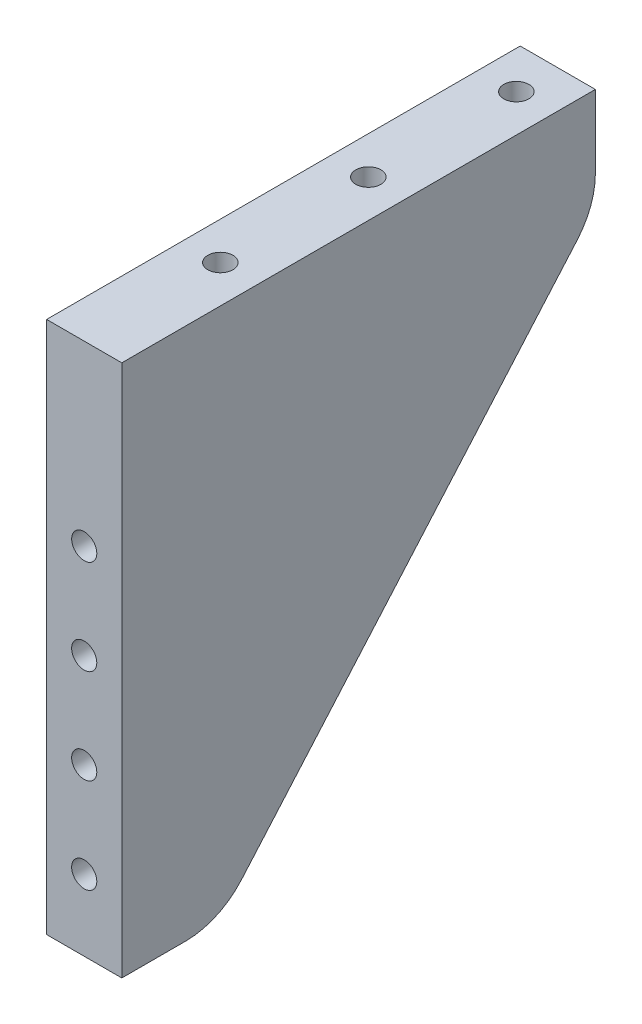
ISO-10303-21;
HEADER;
FILE_DESCRIPTION(('STEP AP214'),'2;1');
FILE_NAME('part.step','',(''),(''),'','','');
FILE_SCHEMA(('AUTOMOTIVE_DESIGN { 1 0 10303 214 1 1 1 1 }'));
ENDSEC;
DATA;
#1=APPLICATION_CONTEXT('core data for automotive mechanical design processes');
#2=APPLICATION_PROTOCOL_DEFINITION('international standard','automotive_design',2000,#1);
#3=PRODUCT_CONTEXT('',#1,'mechanical');
#4=PRODUCT('Part','Part','',(#3));
#5=PRODUCT_RELATED_PRODUCT_CATEGORY('part','',(#4));
#6=PRODUCT_DEFINITION_FORMATION('','',#4);
#7=PRODUCT_DEFINITION_CONTEXT('part definition',#1,'design');
#8=PRODUCT_DEFINITION('design','',#6,#7);
#9=PRODUCT_DEFINITION_SHAPE('','',#8);
#10=(LENGTH_UNIT() NAMED_UNIT(*) SI_UNIT(.MILLI.,.METRE.));
#11=(NAMED_UNIT(*) PLANE_ANGLE_UNIT() SI_UNIT($,.RADIAN.));
#12=(NAMED_UNIT(*) SI_UNIT($,.STERADIAN.) SOLID_ANGLE_UNIT());
#13=UNCERTAINTY_MEASURE_WITH_UNIT(LENGTH_MEASURE(1.E-05),#10,'distance_accuracy_value','');
#14=(GEOMETRIC_REPRESENTATION_CONTEXT(3) GLOBAL_UNCERTAINTY_ASSIGNED_CONTEXT((#13)) GLOBAL_UNIT_ASSIGNED_CONTEXT((#10,
#11,#12)) REPRESENTATION_CONTEXT('',''));
#15=CARTESIAN_POINT('',(0.,0.,0.));
#16=DIRECTION('',(0.,0.,1.));
#17=DIRECTION('',(1.,0.,0.));
#18=AXIS2_PLACEMENT_3D('',#15,#16,#17);
#19=CARTESIAN_POINT('',(12.7,0.,0.));
#20=DIRECTION('',(0.,1.,0.));
#21=DIRECTION('',(0.,0.,1.));
#22=AXIS2_PLACEMENT_3D('',#19,#20,#21);
#23=PLANE('',#22);
#24=DIRECTION('',(0.,0.,-1.));
#25=VECTOR('',#24,1.);
#26=CARTESIAN_POINT('',(12.7,0.,0.));
#27=LINE('',#26,#25);
#28=CARTESIAN_POINT('',(12.7,0.,-5.09999999999999));
#29=VERTEX_POINT('',#28);
#30=CARTESIAN_POINT('',(12.7,0.,-26.7092377084169));
#31=VERTEX_POINT('',#30);
#32=EDGE_CURVE('E89',#29,#31,#27,.T.);
#33=ORIENTED_EDGE('',*,*,#32,.F.);
#34=DIRECTION('',(1.,0.,0.));
#35=VECTOR('',#34,1.);
#36=CARTESIAN_POINT('',(-19.05,0.,-5.09999999999999));
#37=LINE('',#36,#35);
#38=CARTESIAN_POINT('',(-12.7,0.,-5.09999999999999));
#39=VERTEX_POINT('',#38);
#40=EDGE_CURVE('E182',#39,#29,#37,.T.);
#41=ORIENTED_EDGE('',*,*,#40,.F.);
#42=DIRECTION('',(0.,0.,-1.));
#43=VECTOR('',#42,1.);
#44=CARTESIAN_POINT('',(-12.7,0.,0.));
#45=LINE('',#44,#43);
#46=CARTESIAN_POINT('',(-12.7,0.,-26.7092377084169));
#47=VERTEX_POINT('',#46);
#48=EDGE_CURVE('E184',#39,#47,#45,.T.);
#49=ORIENTED_EDGE('',*,*,#48,.T.);
#50=DIRECTION('',(-1.,0.,0.));
#51=VECTOR('',#50,1.);
#52=CARTESIAN_POINT('',(12.7,0.,-26.7092377084169));
#53=LINE('',#52,#51);
#54=EDGE_CURVE('E211',#31,#47,#53,.T.);
#55=ORIENTED_EDGE('',*,*,#54,.F.);
#56=EDGE_LOOP('',(#33,#41,#49,#55));
#57=FACE_BOUND('',#56,.T.);
#58=ADVANCED_FACE('F38',(#57),#23,.F.);
#59=CARTESIAN_POINT('',(12.7,25.,-26.709237708417));
#60=DIRECTION('',(-1.,0.,0.));
#61=DIRECTION('',(0.,0.,1.));
#62=AXIS2_PLACEMENT_3D('',#59,#60,#61);
#63=CYLINDRICAL_SURFACE('',#62,25.);
#64=CARTESIAN_POINT('',(-12.7,25.,-26.709237708417));
#65=DIRECTION('',(1.,0.,0.));
#66=DIRECTION('',(0.,0.,-1.));
#67=AXIS2_PLACEMENT_3D('',#64,#65,#66);
#68=CIRCLE('',#67,25.);
#69=CARTESIAN_POINT('',(-12.7,8.59553212688041,-45.5743757625047));
#70=VERTEX_POINT('',#69);
#71=EDGE_CURVE('E198',#47,#70,#68,.T.);
#72=ORIENTED_EDGE('',*,*,#71,.T.);
#73=DIRECTION('',(-1.,0.,0.));
#74=VECTOR('',#73,1.);
#75=CARTESIAN_POINT('',(12.7,8.59553212688041,-45.5743757625047));
#76=LINE('',#75,#74);
#77=CARTESIAN_POINT('',(12.7,8.59553212688041,-45.5743757625047));
#78=VERTEX_POINT('',#77);
#79=EDGE_CURVE('E208',#78,#70,#76,.T.);
#80=ORIENTED_EDGE('',*,*,#79,.F.);
#81=CARTESIAN_POINT('',(12.7,25.,-26.709237708417));
#82=DIRECTION('',(1.,0.,0.));
#83=DIRECTION('',(0.,0.,-1.));
#84=AXIS2_PLACEMENT_3D('',#81,#82,#83);
#85=CIRCLE('',#84,25.);
#86=EDGE_CURVE('E188',#31,#78,#85,.T.);
#87=ORIENTED_EDGE('',*,*,#86,.F.);
#88=ORIENTED_EDGE('',*,*,#54,.T.);
#89=EDGE_LOOP('',(#72,#80,#87,#88));
#90=FACE_BOUND('',#89,.T.);
#91=ADVANCED_FACE('F231',(#90),#63,.T.);
#92=CARTESIAN_POINT('',(12.7,8.59553212688041,-45.5743757625047));
#93=DIRECTION('',(0.,0.656178714924787,0.754605522163505));
#94=DIRECTION('',(0.,-0.754605522163505,0.656178714924787));
#95=AXIS2_PLACEMENT_3D('',#92,#93,#94);
#96=PLANE('',#95);
#97=DIRECTION('',(0.,0.754605522163505,-0.656178714924787));
#98=VECTOR('',#97,1.);
#99=CARTESIAN_POINT('',(-12.7,8.59553212688041,-45.5743757625047));
#100=LINE('',#99,#98);
#101=CARTESIAN_POINT('',(-12.7,138.994908762201,-158.965138054088));
#102=VERTEX_POINT('',#101);
#103=EDGE_CURVE('E200',#70,#102,#100,.T.);
#104=ORIENTED_EDGE('',*,*,#103,.T.);
#105=DIRECTION('',(-1.,0.,0.));
#106=VECTOR('',#105,1.);
#107=CARTESIAN_POINT('',(12.7,138.994908762201,-158.965138054088));
#108=LINE('',#107,#106);
#109=CARTESIAN_POINT('',(12.7,138.994908762201,-158.965138054088));
#110=VERTEX_POINT('',#109);
#111=EDGE_CURVE('E206',#110,#102,#108,.T.);
#112=ORIENTED_EDGE('',*,*,#111,.F.);
#113=DIRECTION('',(0.,0.754605522163505,-0.656178714924787));
#114=VECTOR('',#113,1.);
#115=CARTESIAN_POINT('',(12.7,8.59553212688041,-45.5743757625047));
#116=LINE('',#115,#114);
#117=EDGE_CURVE('E191',#78,#110,#116,.T.);
#118=ORIENTED_EDGE('',*,*,#117,.F.);
#119=ORIENTED_EDGE('',*,*,#79,.T.);
#120=EDGE_LOOP('',(#104,#112,#118,#119));
#121=FACE_BOUND('',#120,.T.);
#122=ADVANCED_FACE('F227',(#121),#96,.F.);
#123=CARTESIAN_POINT('',(12.7,155.39937663532,-140.1));
#124=DIRECTION('',(-1.,0.,0.));
#125=DIRECTION('',(0.,0.,1.));
#126=AXIS2_PLACEMENT_3D('',#123,#124,#125);
#127=CYLINDRICAL_SURFACE('',#126,25.);
#128=CARTESIAN_POINT('',(-12.7,155.39937663532,-140.1));
#129=DIRECTION('',(1.,0.,0.));
#130=DIRECTION('',(0.,0.,-1.));
#131=AXIS2_PLACEMENT_3D('',#128,#129,#130);
#132=CIRCLE('',#131,25.);
#133=CARTESIAN_POINT('',(-12.7,155.399376635321,-165.1));
#134=VERTEX_POINT('',#133);
#135=EDGE_CURVE('E82',#102,#134,#132,.T.);
#136=ORIENTED_EDGE('',*,*,#135,.T.);
#137=DIRECTION('',(-1.,0.,0.));
#138=VECTOR('',#137,1.);
#139=CARTESIAN_POINT('',(12.7,155.399376635321,-165.1));
#140=LINE('',#139,#138);
#141=CARTESIAN_POINT('',(12.7,155.399376635321,-165.1));
#142=VERTEX_POINT('',#141);
#143=EDGE_CURVE('E196',#142,#134,#140,.T.);
#144=ORIENTED_EDGE('',*,*,#143,.F.);
#145=CARTESIAN_POINT('',(12.7,155.39937663532,-140.1));
#146=DIRECTION('',(1.,0.,0.));
#147=DIRECTION('',(0.,0.,-1.));
#148=AXIS2_PLACEMENT_3D('',#145,#146,#147);
#149=CIRCLE('',#148,25.);
#150=EDGE_CURVE('E61',#110,#142,#149,.T.);
#151=ORIENTED_EDGE('',*,*,#150,.F.);
#152=ORIENTED_EDGE('',*,*,#111,.T.);
#153=EDGE_LOOP('',(#136,#144,#151,#152));
#154=FACE_BOUND('',#153,.T.);
#155=ADVANCED_FACE('F221',(#154),#127,.T.);
#156=CARTESIAN_POINT('',(12.7,155.399376635321,-165.1));
#157=DIRECTION('',(0.,0.,1.));
#158=DIRECTION('',(1.,0.,0.));
#159=AXIS2_PLACEMENT_3D('',#156,#157,#158);
#160=PLANE('',#159);
#161=DIRECTION('',(0.,1.,0.));
#162=VECTOR('',#161,1.);
#163=CARTESIAN_POINT('',(-12.7,155.399376635321,-165.1));
#164=LINE('',#163,#162);
#165=CARTESIAN_POINT('',(-12.7,180.,-165.1));
#166=VERTEX_POINT('',#165);
#167=EDGE_CURVE('E189',#134,#166,#164,.T.);
#168=ORIENTED_EDGE('',*,*,#167,.T.);
#169=DIRECTION('',(1.,0.,0.));
#170=VECTOR('',#169,1.);
#171=CARTESIAN_POINT('',(-19.05,180.,-165.1));
#172=LINE('',#171,#170);
#173=CARTESIAN_POINT('',(12.7,180.,-165.1));
#174=VERTEX_POINT('',#173);
#175=EDGE_CURVE('E52',#166,#174,#172,.T.);
#176=ORIENTED_EDGE('',*,*,#175,.T.);
#177=DIRECTION('',(0.,1.,0.));
#178=VECTOR('',#177,1.);
#179=CARTESIAN_POINT('',(12.7,155.399376635321,-165.1));
#180=LINE('',#179,#178);
#181=EDGE_CURVE('E194',#142,#174,#180,.T.);
#182=ORIENTED_EDGE('',*,*,#181,.F.);
#183=ORIENTED_EDGE('',*,*,#143,.T.);
#184=EDGE_LOOP('',(#168,#176,#182,#183));
#185=FACE_BOUND('',#184,.T.);
#186=ADVANCED_FACE('F219',(#185),#160,.F.);
#187=CARTESIAN_POINT('',(12.7,25.,-26.709237708417));
#188=DIRECTION('',(1.,0.,0.));
#189=DIRECTION('',(0.,0.,-1.));
#190=AXIS2_PLACEMENT_3D('',#187,#188,#189);
#191=PLANE('',#190);
#192=DIRECTION('',(0.,1.,0.));
#193=VECTOR('',#192,1.);
#194=CARTESIAN_POINT('',(12.7,0.,-5.09999999999999));
#195=LINE('',#194,#193);
#196=CARTESIAN_POINT('',(12.7,180.,-5.09999999999999));
#197=VERTEX_POINT('',#196);
#198=EDGE_CURVE('E176',#29,#197,#195,.T.);
#199=ORIENTED_EDGE('',*,*,#198,.F.);
#200=ORIENTED_EDGE('',*,*,#32,.T.);
#201=ORIENTED_EDGE('',*,*,#86,.T.);
#202=ORIENTED_EDGE('',*,*,#117,.T.);
#203=ORIENTED_EDGE('',*,*,#150,.T.);
#204=ORIENTED_EDGE('',*,*,#181,.T.);
#205=DIRECTION('',(0.,0.,-1.));
#206=VECTOR('',#205,1.);
#207=CARTESIAN_POINT('',(12.7,180.,-5.09999999999999));
#208=LINE('',#207,#206);
#209=EDGE_CURVE('E179',#197,#174,#208,.T.);
#210=ORIENTED_EDGE('',*,*,#209,.F.);
#211=EDGE_LOOP('',(#199,#200,#201,#202,#203,#204,#210));
#212=FACE_BOUND('',#211,.T.);
#213=ADVANCED_FACE('F237',(#212),#191,.T.);
#214=CARTESIAN_POINT('',(-12.7,25.,-26.709237708417));
#215=DIRECTION('',(1.,0.,0.));
#216=DIRECTION('',(0.,0.,-1.));
#217=AXIS2_PLACEMENT_3D('',#214,#215,#216);
#218=PLANE('',#217);
#219=ORIENTED_EDGE('',*,*,#48,.F.);
#220=DIRECTION('',(0.,1.,0.));
#221=VECTOR('',#220,1.);
#222=CARTESIAN_POINT('',(-12.7,25.,-5.09999999999999));
#223=LINE('',#222,#221);
#224=CARTESIAN_POINT('',(-12.7,180.,-5.09999999999999));
#225=VERTEX_POINT('',#224);
#226=EDGE_CURVE('E11',#39,#225,#223,.T.);
#227=ORIENTED_EDGE('',*,*,#226,.T.);
#228=DIRECTION('',(0.,0.,-1.));
#229=VECTOR('',#228,1.);
#230=CARTESIAN_POINT('',(-12.7,180.,-26.709237708417));
#231=LINE('',#230,#229);
#232=EDGE_CURVE('E45',#225,#166,#231,.T.);
#233=ORIENTED_EDGE('',*,*,#232,.T.);
#234=ORIENTED_EDGE('',*,*,#167,.F.);
#235=ORIENTED_EDGE('',*,*,#135,.F.);
#236=ORIENTED_EDGE('',*,*,#103,.F.);
#237=ORIENTED_EDGE('',*,*,#71,.F.);
#238=EDGE_LOOP('',(#219,#227,#233,#234,#235,#236,#237));
#239=FACE_BOUND('',#238,.T.);
#240=ADVANCED_FACE('F216',(#239),#218,.F.);
#241=CARTESIAN_POINT('',(-19.05,0.,-5.09999999999999));
#242=DIRECTION('',(0.,0.,-1.));
#243=DIRECTION('',(-1.,0.,0.));
#244=AXIS2_PLACEMENT_3D('',#241,#242,#243);
#245=PLANE('',#244);
#246=CARTESIAN_POINT('',(0.,120.,-5.09999999999999));
#247=DIRECTION('',(0.,0.,1.));
#248=DIRECTION('',(1.,0.,0.));
#249=AXIS2_PLACEMENT_3D('',#246,#247,#248);
#250=CIRCLE('',#249,4.24999999999999);
#251=CARTESIAN_POINT('',(4.24999999999999,120.,-5.09999999999999));
#252=VERTEX_POINT('',#251);
#253=EDGE_CURVE('E136',#252,#252,#250,.T.);
#254=ORIENTED_EDGE('',*,*,#253,.F.);
#255=EDGE_LOOP('',(#254));
#256=FACE_BOUND('',#255,.T.);
#257=CARTESIAN_POINT('',(0.,88.,-5.09999999999999));
#258=DIRECTION('',(0.,0.,1.));
#259=DIRECTION('',(1.,0.,0.));
#260=AXIS2_PLACEMENT_3D('',#257,#258,#259);
#261=CIRCLE('',#260,4.24999999999999);
#262=CARTESIAN_POINT('',(4.25,88.,-5.09999999999999));
#263=VERTEX_POINT('',#262);
#264=EDGE_CURVE('E135',#263,#263,#261,.T.);
#265=ORIENTED_EDGE('',*,*,#264,.F.);
#266=EDGE_LOOP('',(#265));
#267=FACE_BOUND('',#266,.T.);
#268=CARTESIAN_POINT('',(0.,56.,-5.09999999999999));
#269=DIRECTION('',(0.,0.,1.));
#270=DIRECTION('',(1.,0.,0.));
#271=AXIS2_PLACEMENT_3D('',#268,#269,#270);
#272=CIRCLE('',#271,4.24999999999999);
#273=CARTESIAN_POINT('',(4.25,56.,-5.09999999999999));
#274=VERTEX_POINT('',#273);
#275=EDGE_CURVE('E146',#274,#274,#272,.T.);
#276=ORIENTED_EDGE('',*,*,#275,.F.);
#277=EDGE_LOOP('',(#276));
#278=FACE_BOUND('',#277,.T.);
#279=CARTESIAN_POINT('',(0.,24.,-5.09999999999999));
#280=DIRECTION('',(0.,0.,1.));
#281=DIRECTION('',(1.,0.,0.));
#282=AXIS2_PLACEMENT_3D('',#279,#280,#281);
#283=CIRCLE('',#282,4.24999999999999);
#284=CARTESIAN_POINT('',(4.25,24.,-5.09999999999999));
#285=VERTEX_POINT('',#284);
#286=EDGE_CURVE('E152',#285,#285,#283,.T.);
#287=ORIENTED_EDGE('',*,*,#286,.F.);
#288=EDGE_LOOP('',(#287));
#289=FACE_BOUND('',#288,.T.);
#290=ORIENTED_EDGE('',*,*,#40,.T.);
#291=ORIENTED_EDGE('',*,*,#198,.T.);
#292=DIRECTION('',(1.,0.,0.));
#293=VECTOR('',#292,1.);
#294=CARTESIAN_POINT('',(-19.05,180.,-5.09999999999999));
#295=LINE('',#294,#293);
#296=EDGE_CURVE('E181',#225,#197,#295,.T.);
#297=ORIENTED_EDGE('',*,*,#296,.F.);
#298=ORIENTED_EDGE('',*,*,#226,.F.);
#299=EDGE_LOOP('',(#290,#291,#297,#298));
#300=FACE_BOUND('',#299,.T.);
#301=ADVANCED_FACE('F235',(#256,#267,#278,#289,#300),#245,.F.);
#302=CARTESIAN_POINT('',(-19.05,180.,-5.09999999999999));
#303=DIRECTION('',(0.,-1.,0.));
#304=DIRECTION('',(0.,0.,-1.));
#305=AXIS2_PLACEMENT_3D('',#302,#303,#304);
#306=PLANE('',#305);
#307=CARTESIAN_POINT('',(0.,180.,-51.100000098));
#308=DIRECTION('',(0.,1.,0.));
#309=DIRECTION('',(0.,0.,1.));
#310=AXIS2_PLACEMENT_3D('',#307,#308,#309);
#311=CIRCLE('',#310,4.25);
#312=CARTESIAN_POINT('',(0.,180.,-46.850000098));
#313=VERTEX_POINT('',#312);
#314=EDGE_CURVE('E158',#313,#313,#311,.T.);
#315=ORIENTED_EDGE('',*,*,#314,.F.);
#316=EDGE_LOOP('',(#315));
#317=FACE_BOUND('',#316,.T.);
#318=CARTESIAN_POINT('',(0.,180.,-101.100000098));
#319=DIRECTION('',(0.,1.,0.));
#320=DIRECTION('',(0.,0.,1.));
#321=AXIS2_PLACEMENT_3D('',#318,#319,#320);
#322=CIRCLE('',#321,4.25);
#323=CARTESIAN_POINT('',(0.,180.,-96.850000098));
#324=VERTEX_POINT('',#323);
#325=EDGE_CURVE('E164',#324,#324,#322,.T.);
#326=ORIENTED_EDGE('',*,*,#325,.F.);
#327=EDGE_LOOP('',(#326));
#328=FACE_BOUND('',#327,.T.);
#329=CARTESIAN_POINT('',(0.,180.,-151.100000098));
#330=DIRECTION('',(0.,1.,0.));
#331=DIRECTION('',(0.,0.,1.));
#332=AXIS2_PLACEMENT_3D('',#329,#330,#331);
#333=CIRCLE('',#332,4.25);
#334=CARTESIAN_POINT('',(0.,180.,-146.850000098));
#335=VERTEX_POINT('',#334);
#336=EDGE_CURVE('E170',#335,#335,#333,.T.);
#337=ORIENTED_EDGE('',*,*,#336,.F.);
#338=EDGE_LOOP('',(#337));
#339=FACE_BOUND('',#338,.T.);
#340=ORIENTED_EDGE('',*,*,#296,.T.);
#341=ORIENTED_EDGE('',*,*,#209,.T.);
#342=ORIENTED_EDGE('',*,*,#175,.F.);
#343=ORIENTED_EDGE('',*,*,#232,.F.);
#344=EDGE_LOOP('',(#340,#341,#342,#343));
#345=FACE_BOUND('',#344,.T.);
#346=ADVANCED_FACE('F238',(#317,#328,#339,#345),#306,.F.);
#347=CARTESIAN_POINT('',(0.,152.5,-151.100000098));
#348=DIRECTION('',(0.,1.,0.));
#349=DIRECTION('',(0.,0.,1.));
#350=AXIS2_PLACEMENT_3D('',#347,#348,#349);
#351=CONICAL_SURFACE('',#350,4.24999999999999,1.02974425867665);
#352=CARTESIAN_POINT('',(0.,149.946342369133,-151.100000098));
#353=VERTEX_POINT('',#352);
#354=VERTEX_LOOP('',#353);
#355=FACE_BOUND('',#354,.T.);
#356=CARTESIAN_POINT('',(0.,152.5,-151.100000098));
#357=DIRECTION('',(0.,1.,0.));
#358=DIRECTION('',(0.,0.,1.));
#359=AXIS2_PLACEMENT_3D('',#356,#357,#358);
#360=CIRCLE('',#359,4.24999999999999);
#361=CARTESIAN_POINT('',(0.,152.5,-146.850000098));
#362=VERTEX_POINT('',#361);
#363=EDGE_CURVE('E173',#362,#362,#360,.T.);
#364=ORIENTED_EDGE('',*,*,#363,.T.);
#365=EDGE_LOOP('',(#364));
#366=FACE_BOUND('',#365,.T.);
#367=ADVANCED_FACE('F240',(#355,#366),#351,.F.);
#368=CARTESIAN_POINT('',(0.,180.,-151.100000098));
#369=DIRECTION('',(0.,1.,0.));
#370=DIRECTION('',(0.,0.,1.));
#371=AXIS2_PLACEMENT_3D('',#368,#369,#370);
#372=CYLINDRICAL_SURFACE('',#371,4.24999999999999);
#373=ORIENTED_EDGE('',*,*,#363,.F.);
#374=EDGE_LOOP('',(#373));
#375=FACE_BOUND('',#374,.T.);
#376=ORIENTED_EDGE('',*,*,#336,.T.);
#377=EDGE_LOOP('',(#376));
#378=FACE_BOUND('',#377,.T.);
#379=ADVANCED_FACE('F247',(#375,#378),#372,.F.);
#380=CARTESIAN_POINT('',(0.,152.5,-101.100000098));
#381=DIRECTION('',(0.,1.,0.));
#382=DIRECTION('',(0.,0.,1.));
#383=AXIS2_PLACEMENT_3D('',#380,#381,#382);
#384=CONICAL_SURFACE('',#383,4.24999999999999,1.02974425867665);
#385=CARTESIAN_POINT('',(0.,149.946342369133,-101.100000098));
#386=VERTEX_POINT('',#385);
#387=VERTEX_LOOP('',#386);
#388=FACE_BOUND('',#387,.T.);
#389=CARTESIAN_POINT('',(0.,152.5,-101.100000098));
#390=DIRECTION('',(0.,1.,0.));
#391=DIRECTION('',(0.,0.,1.));
#392=AXIS2_PLACEMENT_3D('',#389,#390,#391);
#393=CIRCLE('',#392,4.24999999999999);
#394=CARTESIAN_POINT('',(0.,152.5,-96.850000098));
#395=VERTEX_POINT('',#394);
#396=EDGE_CURVE('E167',#395,#395,#393,.T.);
#397=ORIENTED_EDGE('',*,*,#396,.T.);
#398=EDGE_LOOP('',(#397));
#399=FACE_BOUND('',#398,.T.);
#400=ADVANCED_FACE('F383',(#388,#399),#384,.F.);
#401=CARTESIAN_POINT('',(0.,180.,-101.100000098));
#402=DIRECTION('',(0.,1.,0.));
#403=DIRECTION('',(0.,0.,1.));
#404=AXIS2_PLACEMENT_3D('',#401,#402,#403);
#405=CYLINDRICAL_SURFACE('',#404,4.24999999999999);
#406=ORIENTED_EDGE('',*,*,#396,.F.);
#407=EDGE_LOOP('',(#406));
#408=FACE_BOUND('',#407,.T.);
#409=ORIENTED_EDGE('',*,*,#325,.T.);
#410=EDGE_LOOP('',(#409));
#411=FACE_BOUND('',#410,.T.);
#412=ADVANCED_FACE('F377',(#408,#411),#405,.F.);
#413=CARTESIAN_POINT('',(0.,152.5,-51.100000098));
#414=DIRECTION('',(0.,1.,0.));
#415=DIRECTION('',(0.,0.,1.));
#416=AXIS2_PLACEMENT_3D('',#413,#414,#415);
#417=CONICAL_SURFACE('',#416,4.24999999999999,1.02974425867665);
#418=CARTESIAN_POINT('',(0.,149.946342369133,-51.100000098));
#419=VERTEX_POINT('',#418);
#420=VERTEX_LOOP('',#419);
#421=FACE_BOUND('',#420,.T.);
#422=CARTESIAN_POINT('',(0.,152.5,-51.100000098));
#423=DIRECTION('',(0.,1.,0.));
#424=DIRECTION('',(0.,0.,1.));
#425=AXIS2_PLACEMENT_3D('',#422,#423,#424);
#426=CIRCLE('',#425,4.24999999999999);
#427=CARTESIAN_POINT('',(0.,152.5,-46.850000098));
#428=VERTEX_POINT('',#427);
#429=EDGE_CURVE('E161',#428,#428,#426,.T.);
#430=ORIENTED_EDGE('',*,*,#429,.T.);
#431=EDGE_LOOP('',(#430));
#432=FACE_BOUND('',#431,.T.);
#433=ADVANCED_FACE('F382',(#421,#432),#417,.F.);
#434=CARTESIAN_POINT('',(0.,180.,-51.100000098));
#435=DIRECTION('',(0.,1.,0.));
#436=DIRECTION('',(0.,0.,1.));
#437=AXIS2_PLACEMENT_3D('',#434,#435,#436);
#438=CYLINDRICAL_SURFACE('',#437,4.24999999999999);
#439=ORIENTED_EDGE('',*,*,#429,.F.);
#440=EDGE_LOOP('',(#439));
#441=FACE_BOUND('',#440,.T.);
#442=ORIENTED_EDGE('',*,*,#314,.T.);
#443=EDGE_LOOP('',(#442));
#444=FACE_BOUND('',#443,.T.);
#445=ADVANCED_FACE('F289',(#441,#444),#438,.F.);
#446=CARTESIAN_POINT('',(0.,24.,-32.6));
#447=DIRECTION('',(0.,0.,1.));
#448=DIRECTION('',(1.,0.,0.));
#449=AXIS2_PLACEMENT_3D('',#446,#447,#448);
#450=CONICAL_SURFACE('',#449,4.24999999999999,1.02974425867665);
#451=CARTESIAN_POINT('',(0.,24.,-35.1536576308671));
#452=VERTEX_POINT('',#451);
#453=VERTEX_LOOP('',#452);
#454=FACE_BOUND('',#453,.T.);
#455=CARTESIAN_POINT('',(0.,24.,-32.6));
#456=DIRECTION('',(0.,0.,1.));
#457=DIRECTION('',(1.,0.,0.));
#458=AXIS2_PLACEMENT_3D('',#455,#456,#457);
#459=CIRCLE('',#458,4.24999999999999);
#460=CARTESIAN_POINT('',(4.25000000000001,24.,-32.6));
#461=VERTEX_POINT('',#460);
#462=EDGE_CURVE('E155',#461,#461,#459,.T.);
#463=ORIENTED_EDGE('',*,*,#462,.T.);
#464=EDGE_LOOP('',(#463));
#465=FACE_BOUND('',#464,.T.);
#466=ADVANCED_FACE('F294',(#454,#465),#450,.F.);
#467=CARTESIAN_POINT('',(0.,24.,-5.09999999999999));
#468=DIRECTION('',(0.,0.,1.));
#469=DIRECTION('',(1.,0.,0.));
#470=AXIS2_PLACEMENT_3D('',#467,#468,#469);
#471=CYLINDRICAL_SURFACE('',#470,4.24999999999999);
#472=ORIENTED_EDGE('',*,*,#462,.F.);
#473=EDGE_LOOP('',(#472));
#474=FACE_BOUND('',#473,.T.);
#475=ORIENTED_EDGE('',*,*,#286,.T.);
#476=EDGE_LOOP('',(#475));
#477=FACE_BOUND('',#476,.T.);
#478=ADVANCED_FACE('F299',(#474,#477),#471,.F.);
#479=CARTESIAN_POINT('',(0.,56.,-32.6));
#480=DIRECTION('',(0.,0.,1.));
#481=DIRECTION('',(1.,0.,0.));
#482=AXIS2_PLACEMENT_3D('',#479,#480,#481);
#483=CONICAL_SURFACE('',#482,4.24999999999999,1.02974425867665);
#484=CARTESIAN_POINT('',(0.,56.,-35.1536576308671));
#485=VERTEX_POINT('',#484);
#486=VERTEX_LOOP('',#485);
#487=FACE_BOUND('',#486,.T.);
#488=CARTESIAN_POINT('',(0.,56.,-32.6));
#489=DIRECTION('',(0.,0.,1.));
#490=DIRECTION('',(1.,0.,0.));
#491=AXIS2_PLACEMENT_3D('',#488,#489,#490);
#492=CIRCLE('',#491,4.24999999999999);
#493=CARTESIAN_POINT('',(4.25,56.,-32.6));
#494=VERTEX_POINT('',#493);
#495=EDGE_CURVE('E149',#494,#494,#492,.T.);
#496=ORIENTED_EDGE('',*,*,#495,.T.);
#497=EDGE_LOOP('',(#496));
#498=FACE_BOUND('',#497,.T.);
#499=ADVANCED_FACE('F311',(#487,#498),#483,.F.);
#500=CARTESIAN_POINT('',(0.,56.,-5.09999999999999));
#501=DIRECTION('',(0.,0.,1.));
#502=DIRECTION('',(1.,0.,0.));
#503=AXIS2_PLACEMENT_3D('',#500,#501,#502);
#504=CYLINDRICAL_SURFACE('',#503,4.24999999999999);
#505=ORIENTED_EDGE('',*,*,#495,.F.);
#506=EDGE_LOOP('',(#505));
#507=FACE_BOUND('',#506,.T.);
#508=ORIENTED_EDGE('',*,*,#275,.T.);
#509=EDGE_LOOP('',(#508));
#510=FACE_BOUND('',#509,.T.);
#511=ADVANCED_FACE('F323',(#507,#510),#504,.F.);
#512=CARTESIAN_POINT('',(0.,88.,-32.6));
#513=DIRECTION('',(0.,0.,1.));
#514=DIRECTION('',(1.,0.,0.));
#515=AXIS2_PLACEMENT_3D('',#512,#513,#514);
#516=CONICAL_SURFACE('',#515,4.24999999999999,1.02974425867665);
#517=CARTESIAN_POINT('',(0.,88.,-35.1536576308671));
#518=VERTEX_POINT('',#517);
#519=VERTEX_LOOP('',#518);
#520=FACE_BOUND('',#519,.T.);
#521=CARTESIAN_POINT('',(0.,88.,-32.6));
#522=DIRECTION('',(0.,0.,1.));
#523=DIRECTION('',(1.,0.,0.));
#524=AXIS2_PLACEMENT_3D('',#521,#522,#523);
#525=CIRCLE('',#524,4.24999999999999);
#526=CARTESIAN_POINT('',(4.25,88.,-32.6));
#527=VERTEX_POINT('',#526);
#528=EDGE_CURVE('E139',#527,#527,#525,.T.);
#529=ORIENTED_EDGE('',*,*,#528,.T.);
#530=EDGE_LOOP('',(#529));
#531=FACE_BOUND('',#530,.T.);
#532=ADVANCED_FACE('F333',(#520,#531),#516,.F.);
#533=CARTESIAN_POINT('',(0.,88.,-5.09999999999999));
#534=DIRECTION('',(0.,0.,1.));
#535=DIRECTION('',(1.,0.,0.));
#536=AXIS2_PLACEMENT_3D('',#533,#534,#535);
#537=CYLINDRICAL_SURFACE('',#536,4.24999999999999);
#538=ORIENTED_EDGE('',*,*,#528,.F.);
#539=EDGE_LOOP('',(#538));
#540=FACE_BOUND('',#539,.T.);
#541=ORIENTED_EDGE('',*,*,#264,.T.);
#542=EDGE_LOOP('',(#541));
#543=FACE_BOUND('',#542,.T.);
#544=ADVANCED_FACE('F129',(#540,#543),#537,.F.);
#545=CARTESIAN_POINT('',(0.,120.,-32.6));
#546=DIRECTION('',(0.,0.,1.));
#547=DIRECTION('',(1.,0.,0.));
#548=AXIS2_PLACEMENT_3D('',#545,#546,#547);
#549=CONICAL_SURFACE('',#548,4.24999999999999,1.02974425867665);
#550=CARTESIAN_POINT('',(0.,120.,-35.1536576308671));
#551=VERTEX_POINT('',#550);
#552=VERTEX_LOOP('',#551);
#553=FACE_BOUND('',#552,.T.);
#554=CARTESIAN_POINT('',(0.,120.,-32.6));
#555=DIRECTION('',(0.,0.,1.));
#556=DIRECTION('',(1.,0.,0.));
#557=AXIS2_PLACEMENT_3D('',#554,#555,#556);
#558=CIRCLE('',#557,4.24999999999999);
#559=CARTESIAN_POINT('',(4.24999999999999,120.,-32.6));
#560=VERTEX_POINT('',#559);
#561=EDGE_CURVE('E133',#560,#560,#558,.T.);
#562=ORIENTED_EDGE('',*,*,#561,.T.);
#563=EDGE_LOOP('',(#562));
#564=FACE_BOUND('',#563,.T.);
#565=ADVANCED_FACE('F125',(#553,#564),#549,.F.);
#566=CARTESIAN_POINT('',(0.,120.,-5.09999999999999));
#567=DIRECTION('',(0.,0.,1.));
#568=DIRECTION('',(1.,0.,0.));
#569=AXIS2_PLACEMENT_3D('',#566,#567,#568);
#570=CYLINDRICAL_SURFACE('',#569,4.24999999999999);
#571=ORIENTED_EDGE('',*,*,#561,.F.);
#572=EDGE_LOOP('',(#571));
#573=FACE_BOUND('',#572,.T.);
#574=ORIENTED_EDGE('',*,*,#253,.T.);
#575=EDGE_LOOP('',(#574));
#576=FACE_BOUND('',#575,.T.);
#577=ADVANCED_FACE('F128',(#573,#576),#570,.F.);
#578=CLOSED_SHELL('',(#58,#91,#122,#155,#186,#213,#240,#301,#346,#367,#379,#400,#412,#433,#445,
#466,#478,#499,#511,#532,#544,#565,#577));
#579=MANIFOLD_SOLID_BREP('B2',#578);
#580=ADVANCED_BREP_SHAPE_REPRESENTATION('',(#18,#579),#14);
#581=SHAPE_DEFINITION_REPRESENTATION(#9,#580);
ENDSEC;
END-ISO-10303-21;
